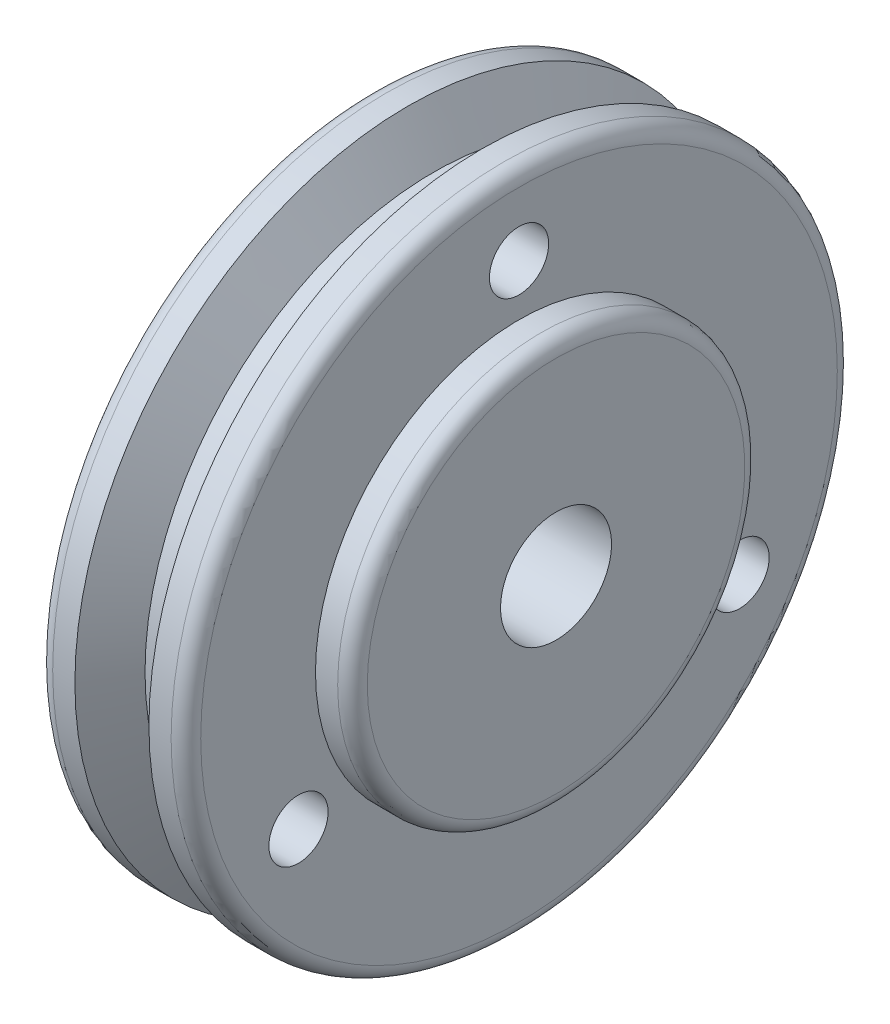
ISO-10303-21;
HEADER;
FILE_DESCRIPTION(('STEP AP214'),'2;1');
FILE_NAME('part.step','',(''),(''),'','','');
FILE_SCHEMA(('AUTOMOTIVE_DESIGN { 1 0 10303 214 1 1 1 1 }'));
ENDSEC;
DATA;
#1=APPLICATION_CONTEXT('core data for automotive mechanical design processes');
#2=APPLICATION_PROTOCOL_DEFINITION('international standard','automotive_design',2000,#1);
#3=PRODUCT_CONTEXT('',#1,'mechanical');
#4=PRODUCT('Part','Part','',(#3));
#5=PRODUCT_RELATED_PRODUCT_CATEGORY('part','',(#4));
#6=PRODUCT_DEFINITION_FORMATION('','',#4);
#7=PRODUCT_DEFINITION_CONTEXT('part definition',#1,'design');
#8=PRODUCT_DEFINITION('design','',#6,#7);
#9=PRODUCT_DEFINITION_SHAPE('','',#8);
#10=(LENGTH_UNIT() NAMED_UNIT(*) SI_UNIT(.MILLI.,.METRE.));
#11=(NAMED_UNIT(*) PLANE_ANGLE_UNIT() SI_UNIT($,.RADIAN.));
#12=(NAMED_UNIT(*) SI_UNIT($,.STERADIAN.) SOLID_ANGLE_UNIT());
#13=UNCERTAINTY_MEASURE_WITH_UNIT(LENGTH_MEASURE(1.E-05),#10,'distance_accuracy_value','');
#14=(GEOMETRIC_REPRESENTATION_CONTEXT(3) GLOBAL_UNCERTAINTY_ASSIGNED_CONTEXT((#13)) GLOBAL_UNIT_ASSIGNED_CONTEXT((#10,
#11,#12)) REPRESENTATION_CONTEXT('',''));
#15=CARTESIAN_POINT('',(0.,0.,0.));
#16=DIRECTION('',(0.,0.,1.));
#17=DIRECTION('',(1.,0.,0.));
#18=AXIS2_PLACEMENT_3D('',#15,#16,#17);
#19=CARTESIAN_POINT('',(18.4991145218418,20.0206611570248,0.));
#20=DIRECTION('',(-1.,0.,0.));
#21=DIRECTION('',(0.,0.,1.));
#22=AXIS2_PLACEMENT_3D('',#19,#20,#21);
#23=PLANE('',#22);
#24=CARTESIAN_POINT('',(18.4991145218418,0.,0.));
#25=DIRECTION('',(-1.,0.,0.));
#26=DIRECTION('',(0.,0.,1.));
#27=AXIS2_PLACEMENT_3D('',#24,#25,#26);
#28=CIRCLE('',#27,25.5);
#29=CARTESIAN_POINT('',(18.4991145218418,0.,25.5));
#30=VERTEX_POINT('',#29);
#31=EDGE_CURVE('E10',#30,#30,#28,.T.);
#32=ORIENTED_EDGE('',*,*,#31,.F.);
#33=EDGE_LOOP('',(#32));
#34=FACE_BOUND('',#33,.T.);
#35=CARTESIAN_POINT('',(18.4991145218418,0.,0.));
#36=DIRECTION('',(-1.,0.,0.));
#37=DIRECTION('',(0.,0.,1.));
#38=AXIS2_PLACEMENT_3D('',#35,#36,#37);
#39=CIRCLE('',#38,7.5);
#40=CARTESIAN_POINT('',(18.4991145218418,0.,7.5));
#41=VERTEX_POINT('',#40);
#42=EDGE_CURVE('E61',#41,#41,#39,.T.);
#43=ORIENTED_EDGE('',*,*,#42,.T.);
#44=EDGE_LOOP('',(#43));
#45=FACE_BOUND('',#44,.T.);
#46=ADVANCED_FACE('F37',(#34,#45),#23,.F.);
#47=CARTESIAN_POINT('',(16.4991145218418,0.,0.));
#48=DIRECTION('',(-1.,0.,0.));
#49=DIRECTION('',(0.,0.,1.));
#50=AXIS2_PLACEMENT_3D('',#47,#48,#49);
#51=TOROIDAL_SURFACE('',#50,25.5,2.);
#52=CARTESIAN_POINT('',(16.4991145218418,0.,0.));
#53=DIRECTION('',(-1.,0.,0.));
#54=DIRECTION('',(0.,0.,1.));
#55=AXIS2_PLACEMENT_3D('',#52,#53,#54);
#56=CIRCLE('',#55,27.5);
#57=CARTESIAN_POINT('',(16.4991145218418,0.,27.5));
#58=VERTEX_POINT('',#57);
#59=EDGE_CURVE('E44',#58,#58,#56,.T.);
#60=ORIENTED_EDGE('',*,*,#59,.F.);
#61=EDGE_LOOP('',(#60));
#62=FACE_BOUND('',#61,.T.);
#63=ORIENTED_EDGE('',*,*,#31,.T.);
#64=EDGE_LOOP('',(#63));
#65=FACE_BOUND('',#64,.T.);
#66=ADVANCED_FACE('F115',(#62,#65),#51,.T.);
#67=CARTESIAN_POINT('',(-33.8562573789847,0.,0.));
#68=DIRECTION('',(-1.,0.,0.));
#69=DIRECTION('',(0.,0.,1.));
#70=AXIS2_PLACEMENT_3D('',#67,#68,#69);
#71=CYLINDRICAL_SURFACE('',#70,27.5);
#72=CARTESIAN_POINT('',(13.4991145218418,0.,0.));
#73=DIRECTION('',(-1.,0.,0.));
#74=DIRECTION('',(0.,0.,1.));
#75=AXIS2_PLACEMENT_3D('',#72,#73,#74);
#76=CIRCLE('',#75,27.5);
#77=CARTESIAN_POINT('',(13.4991145218418,0.,27.5));
#78=VERTEX_POINT('',#77);
#79=EDGE_CURVE('E49',#78,#78,#76,.T.);
#80=ORIENTED_EDGE('',*,*,#79,.F.);
#81=EDGE_LOOP('',(#80));
#82=FACE_BOUND('',#81,.T.);
#83=ORIENTED_EDGE('',*,*,#59,.T.);
#84=EDGE_LOOP('',(#83));
#85=FACE_BOUND('',#84,.T.);
#86=ADVANCED_FACE('F112',(#82,#85),#71,.T.);
#87=CARTESIAN_POINT('',(13.4991145218418,27.5,0.));
#88=DIRECTION('',(-1.,0.,0.));
#89=DIRECTION('',(0.,0.,1.));
#90=AXIS2_PLACEMENT_3D('',#87,#88,#89);
#91=PLANE('',#90);
#92=CARTESIAN_POINT('',(13.4991145218418,34.4021697757463,0.));
#93=DIRECTION('',(1.,0.,0.));
#94=DIRECTION('',(0.,0.,-1.));
#95=AXIS2_PLACEMENT_3D('',#92,#93,#94);
#96=CIRCLE('',#95,4.);
#97=CARTESIAN_POINT('',(13.4991145218418,34.4021697757463,-4.));
#98=VERTEX_POINT('',#97);
#99=EDGE_CURVE('E56',#98,#98,#96,.T.);
#100=ORIENTED_EDGE('',*,*,#99,.F.);
#101=EDGE_LOOP('',(#100));
#102=FACE_BOUND('',#101,.T.);
#103=CARTESIAN_POINT('',(13.4991145218418,-17.2010848878727,-29.7931529711022));
#104=DIRECTION('',(1.,0.,0.));
#105=DIRECTION('',(0.,0.,-1.));
#106=AXIS2_PLACEMENT_3D('',#103,#104,#105);
#107=CIRCLE('',#106,4.00000000000074);
#108=CARTESIAN_POINT('',(13.4991145218418,-17.2010848878727,-33.7931529711029));
#109=VERTEX_POINT('',#108);
#110=EDGE_CURVE('E191',#109,#109,#107,.T.);
#111=ORIENTED_EDGE('',*,*,#110,.F.);
#112=EDGE_LOOP('',(#111));
#113=FACE_BOUND('',#112,.T.);
#114=CARTESIAN_POINT('',(13.4991145218418,-17.2010848878736,29.7931529711008));
#115=DIRECTION('',(1.,0.,0.));
#116=DIRECTION('',(0.,0.,-1.));
#117=AXIS2_PLACEMENT_3D('',#114,#115,#116);
#118=CIRCLE('',#117,4.00000000000111);
#119=CARTESIAN_POINT('',(13.4991145218418,-17.2010848878736,25.7931529710997));
#120=VERTEX_POINT('',#119);
#121=EDGE_CURVE('E73',#120,#120,#118,.T.);
#122=ORIENTED_EDGE('',*,*,#121,.F.);
#123=EDGE_LOOP('',(#122));
#124=FACE_BOUND('',#123,.T.);
#125=CARTESIAN_POINT('',(13.4991145218418,0.,0.));
#126=DIRECTION('',(-1.,0.,0.));
#127=DIRECTION('',(0.,0.,1.));
#128=AXIS2_PLACEMENT_3D('',#125,#126,#127);
#129=CIRCLE('',#128,43.);
#130=CARTESIAN_POINT('',(13.4991145218418,0.,43.));
#131=VERTEX_POINT('',#130);
#132=EDGE_CURVE('E105',#131,#131,#129,.T.);
#133=ORIENTED_EDGE('',*,*,#132,.F.);
#134=EDGE_LOOP('',(#133));
#135=FACE_BOUND('',#134,.T.);
#136=ORIENTED_EDGE('',*,*,#79,.T.);
#137=EDGE_LOOP('',(#136));
#138=FACE_BOUND('',#137,.T.);
#139=ADVANCED_FACE('F110',(#102,#113,#124,#135,#138),#91,.F.);
#140=CARTESIAN_POINT('',(11.4991145218418,0.,0.));
#141=DIRECTION('',(-1.,0.,0.));
#142=DIRECTION('',(0.,0.,1.));
#143=AXIS2_PLACEMENT_3D('',#140,#141,#142);
#144=TOROIDAL_SURFACE('',#143,43.,2.);
#145=CARTESIAN_POINT('',(11.4991145218418,0.,0.));
#146=DIRECTION('',(-1.,0.,0.));
#147=DIRECTION('',(0.,0.,1.));
#148=AXIS2_PLACEMENT_3D('',#145,#146,#147);
#149=CIRCLE('',#148,45.);
#150=CARTESIAN_POINT('',(11.4991145218418,0.,45.));
#151=VERTEX_POINT('',#150);
#152=EDGE_CURVE('E102',#151,#151,#149,.T.);
#153=ORIENTED_EDGE('',*,*,#152,.F.);
#154=EDGE_LOOP('',(#153));
#155=FACE_BOUND('',#154,.T.);
#156=ORIENTED_EDGE('',*,*,#132,.T.);
#157=EDGE_LOOP('',(#156));
#158=FACE_BOUND('',#157,.T.);
#159=ADVANCED_FACE('F127',(#155,#158),#144,.T.);
#160=CARTESIAN_POINT('',(-33.8562573789847,0.,0.));
#161=DIRECTION('',(-1.,0.,0.));
#162=DIRECTION('',(0.,0.,1.));
#163=AXIS2_PLACEMENT_3D('',#160,#161,#162);
#164=CYLINDRICAL_SURFACE('',#163,45.);
#165=CARTESIAN_POINT('',(8.49911452184179,0.,0.));
#166=DIRECTION('',(-1.,0.,0.));
#167=DIRECTION('',(0.,0.,1.));
#168=AXIS2_PLACEMENT_3D('',#165,#166,#167);
#169=CIRCLE('',#168,45.);
#170=CARTESIAN_POINT('',(8.49911452184179,0.,45.));
#171=VERTEX_POINT('',#170);
#172=EDGE_CURVE('E99',#171,#171,#169,.T.);
#173=ORIENTED_EDGE('',*,*,#172,.F.);
#174=EDGE_LOOP('',(#173));
#175=FACE_BOUND('',#174,.T.);
#176=ORIENTED_EDGE('',*,*,#152,.T.);
#177=EDGE_LOOP('',(#176));
#178=FACE_BOUND('',#177,.T.);
#179=ADVANCED_FACE('F131',(#175,#178),#164,.T.);
#180=CARTESIAN_POINT('',(8.49911452184179,0.,0.));
#181=DIRECTION('',(1.,0.,0.));
#182=DIRECTION('',(0.,0.,-1.));
#183=AXIS2_PLACEMENT_3D('',#180,#181,#182);
#184=CONICAL_SURFACE('',#183,45.,1.17190446851137);
#185=CARTESIAN_POINT('',(5.97018890200708,0.,0.));
#186=DIRECTION('',(-1.,0.,0.));
#187=DIRECTION('',(0.,0.,1.));
#188=AXIS2_PLACEMENT_3D('',#185,#186,#187);
#189=CIRCLE('',#188,39.);
#190=CARTESIAN_POINT('',(5.97018890200708,0.,39.));
#191=VERTEX_POINT('',#190);
#192=EDGE_CURVE('E96',#191,#191,#189,.T.);
#193=ORIENTED_EDGE('',*,*,#192,.F.);
#194=EDGE_LOOP('',(#193));
#195=FACE_BOUND('',#194,.T.);
#196=ORIENTED_EDGE('',*,*,#172,.T.);
#197=EDGE_LOOP('',(#196));
#198=FACE_BOUND('',#197,.T.);
#199=ADVANCED_FACE('F135',(#195,#198),#184,.T.);
#200=CARTESIAN_POINT('',(-33.8562573789847,0.,0.));
#201=DIRECTION('',(-1.,0.,0.));
#202=DIRECTION('',(0.,0.,1.));
#203=AXIS2_PLACEMENT_3D('',#200,#201,#202);
#204=CYLINDRICAL_SURFACE('',#203,39.);
#205=CARTESIAN_POINT('',(1.97018890200708,0.,0.));
#206=DIRECTION('',(-1.,0.,0.));
#207=DIRECTION('',(0.,0.,1.));
#208=AXIS2_PLACEMENT_3D('',#205,#206,#207);
#209=CIRCLE('',#208,39.);
#210=CARTESIAN_POINT('',(1.97018890200708,0.,39.));
#211=VERTEX_POINT('',#210);
#212=EDGE_CURVE('E93',#211,#211,#209,.T.);
#213=ORIENTED_EDGE('',*,*,#212,.F.);
#214=EDGE_LOOP('',(#213));
#215=FACE_BOUND('',#214,.T.);
#216=ORIENTED_EDGE('',*,*,#192,.T.);
#217=EDGE_LOOP('',(#216));
#218=FACE_BOUND('',#217,.T.);
#219=ADVANCED_FACE('F139',(#215,#218),#204,.T.);
#220=CARTESIAN_POINT('',(1.97018890200708,0.,0.));
#221=DIRECTION('',(-1.,0.,0.));
#222=DIRECTION('',(0.,0.,1.));
#223=AXIS2_PLACEMENT_3D('',#220,#221,#222);
#224=CONICAL_SURFACE('',#223,39.,1.04632639416877);
#225=CARTESIAN_POINT('',(-1.50088547815821,0.,0.));
#226=DIRECTION('',(-1.,0.,0.));
#227=DIRECTION('',(0.,0.,1.));
#228=AXIS2_PLACEMENT_3D('',#225,#226,#227);
#229=CIRCLE('',#228,45.);
#230=CARTESIAN_POINT('',(-1.50088547815821,0.,45.));
#231=VERTEX_POINT('',#230);
#232=EDGE_CURVE('E90',#231,#231,#229,.T.);
#233=ORIENTED_EDGE('',*,*,#232,.F.);
#234=EDGE_LOOP('',(#233));
#235=FACE_BOUND('',#234,.T.);
#236=ORIENTED_EDGE('',*,*,#212,.T.);
#237=EDGE_LOOP('',(#236));
#238=FACE_BOUND('',#237,.T.);
#239=ADVANCED_FACE('F143',(#235,#238),#224,.T.);
#240=CARTESIAN_POINT('',(-33.8562573789847,0.,0.));
#241=DIRECTION('',(-1.,0.,0.));
#242=DIRECTION('',(0.,0.,1.));
#243=AXIS2_PLACEMENT_3D('',#240,#241,#242);
#244=CYLINDRICAL_SURFACE('',#243,45.);
#245=CARTESIAN_POINT('',(-4.5008854781582,0.,0.));
#246=DIRECTION('',(-1.,0.,0.));
#247=DIRECTION('',(0.,0.,1.));
#248=AXIS2_PLACEMENT_3D('',#245,#246,#247);
#249=CIRCLE('',#248,45.);
#250=CARTESIAN_POINT('',(-4.5008854781582,0.,45.));
#251=VERTEX_POINT('',#250);
#252=EDGE_CURVE('E87',#251,#251,#249,.T.);
#253=ORIENTED_EDGE('',*,*,#252,.F.);
#254=EDGE_LOOP('',(#253));
#255=FACE_BOUND('',#254,.T.);
#256=ORIENTED_EDGE('',*,*,#232,.T.);
#257=EDGE_LOOP('',(#256));
#258=FACE_BOUND('',#257,.T.);
#259=ADVANCED_FACE('F147',(#255,#258),#244,.T.);
#260=CARTESIAN_POINT('',(-4.50088547815821,0.,0.));
#261=DIRECTION('',(-1.,0.,0.));
#262=DIRECTION('',(0.,0.,1.));
#263=AXIS2_PLACEMENT_3D('',#260,#261,#262);
#264=TOROIDAL_SURFACE('',#263,43.,2.);
#265=CARTESIAN_POINT('',(-6.50088547815821,0.,0.));
#266=DIRECTION('',(-1.,0.,0.));
#267=DIRECTION('',(0.,0.,1.));
#268=AXIS2_PLACEMENT_3D('',#265,#266,#267);
#269=CIRCLE('',#268,43.);
#270=CARTESIAN_POINT('',(-6.50088547815821,0.,43.));
#271=VERTEX_POINT('',#270);
#272=EDGE_CURVE('E84',#271,#271,#269,.T.);
#273=ORIENTED_EDGE('',*,*,#272,.F.);
#274=EDGE_LOOP('',(#273));
#275=FACE_BOUND('',#274,.T.);
#276=ORIENTED_EDGE('',*,*,#252,.T.);
#277=EDGE_LOOP('',(#276));
#278=FACE_BOUND('',#277,.T.);
#279=ADVANCED_FACE('F151',(#275,#278),#264,.T.);
#280=CARTESIAN_POINT('',(-6.50088547815821,17.5,0.));
#281=DIRECTION('',(1.,0.,0.));
#282=DIRECTION('',(0.,0.,-1.));
#283=AXIS2_PLACEMENT_3D('',#280,#281,#282);
#284=PLANE('',#283);
#285=CARTESIAN_POINT('',(-6.50088547815821,34.4021697757463,0.));
#286=DIRECTION('',(1.,0.,0.));
#287=DIRECTION('',(0.,0.,-1.));
#288=AXIS2_PLACEMENT_3D('',#285,#286,#287);
#289=CIRCLE('',#288,4.);
#290=CARTESIAN_POINT('',(-6.50088547815821,34.4021697757463,-4.));
#291=VERTEX_POINT('',#290);
#292=EDGE_CURVE('E40',#291,#291,#289,.T.);
#293=ORIENTED_EDGE('',*,*,#292,.T.);
#294=EDGE_LOOP('',(#293));
#295=FACE_BOUND('',#294,.T.);
#296=CARTESIAN_POINT('',(-6.50088547815821,-17.2010848878727,-29.7931529711022));
#297=DIRECTION('',(1.,0.,0.));
#298=DIRECTION('',(0.,0.,-1.));
#299=AXIS2_PLACEMENT_3D('',#296,#297,#298);
#300=CIRCLE('',#299,4.00000000000074);
#301=CARTESIAN_POINT('',(-6.50088547815821,-17.2010848878727,-33.7931529711029));
#302=VERTEX_POINT('',#301);
#303=EDGE_CURVE('E55',#302,#302,#300,.T.);
#304=ORIENTED_EDGE('',*,*,#303,.T.);
#305=EDGE_LOOP('',(#304));
#306=FACE_BOUND('',#305,.T.);
#307=CARTESIAN_POINT('',(-6.50088547815821,-17.2010848878736,29.7931529711008));
#308=DIRECTION('',(1.,0.,0.));
#309=DIRECTION('',(0.,0.,-1.));
#310=AXIS2_PLACEMENT_3D('',#307,#308,#309);
#311=CIRCLE('',#310,4.00000000000111);
#312=CARTESIAN_POINT('',(-6.50088547815821,-17.2010848878736,25.7931529710997));
#313=VERTEX_POINT('',#312);
#314=EDGE_CURVE('E53',#313,#313,#311,.T.);
#315=ORIENTED_EDGE('',*,*,#314,.T.);
#316=EDGE_LOOP('',(#315));
#317=FACE_BOUND('',#316,.T.);
#318=CARTESIAN_POINT('',(-6.50088547815821,0.,0.));
#319=DIRECTION('',(-1.,0.,0.));
#320=DIRECTION('',(0.,0.,1.));
#321=AXIS2_PLACEMENT_3D('',#318,#319,#320);
#322=CIRCLE('',#321,17.5);
#323=CARTESIAN_POINT('',(-6.50088547815821,0.,17.5));
#324=VERTEX_POINT('',#323);
#325=EDGE_CURVE('E81',#324,#324,#322,.T.);
#326=ORIENTED_EDGE('',*,*,#325,.F.);
#327=EDGE_LOOP('',(#326));
#328=FACE_BOUND('',#327,.T.);
#329=ORIENTED_EDGE('',*,*,#272,.T.);
#330=EDGE_LOOP('',(#329));
#331=FACE_BOUND('',#330,.T.);
#332=ADVANCED_FACE('F155',(#295,#306,#317,#328,#331),#284,.F.);
#333=CARTESIAN_POINT('',(-33.8562573789847,0.,0.));
#334=DIRECTION('',(-1.,0.,0.));
#335=DIRECTION('',(0.,0.,1.));
#336=AXIS2_PLACEMENT_3D('',#333,#334,#335);
#337=CYLINDRICAL_SURFACE('',#336,17.5);
#338=CARTESIAN_POINT('',(-20.5008854781582,0.,0.));
#339=DIRECTION('',(-1.,0.,0.));
#340=DIRECTION('',(0.,0.,1.));
#341=AXIS2_PLACEMENT_3D('',#338,#339,#340);
#342=CIRCLE('',#341,17.5);
#343=CARTESIAN_POINT('',(-20.5008854781582,0.,17.5));
#344=VERTEX_POINT('',#343);
#345=EDGE_CURVE('E78',#344,#344,#342,.T.);
#346=ORIENTED_EDGE('',*,*,#345,.F.);
#347=EDGE_LOOP('',(#346));
#348=FACE_BOUND('',#347,.T.);
#349=ORIENTED_EDGE('',*,*,#325,.T.);
#350=EDGE_LOOP('',(#349));
#351=FACE_BOUND('',#350,.T.);
#352=ADVANCED_FACE('F159',(#348,#351),#337,.T.);
#353=CARTESIAN_POINT('',(-20.5008854781582,0.,0.));
#354=DIRECTION('',(-1.,0.,0.));
#355=DIRECTION('',(0.,0.,1.));
#356=AXIS2_PLACEMENT_3D('',#353,#354,#355);
#357=TOROIDAL_SURFACE('',#356,15.5,2.);
#358=CARTESIAN_POINT('',(-22.5008854781582,0.,0.));
#359=DIRECTION('',(-1.,0.,0.));
#360=DIRECTION('',(0.,0.,1.));
#361=AXIS2_PLACEMENT_3D('',#358,#359,#360);
#362=CIRCLE('',#361,15.5);
#363=CARTESIAN_POINT('',(-22.5008854781582,0.,15.5));
#364=VERTEX_POINT('',#363);
#365=EDGE_CURVE('E70',#364,#364,#362,.T.);
#366=ORIENTED_EDGE('',*,*,#365,.F.);
#367=EDGE_LOOP('',(#366));
#368=FACE_BOUND('',#367,.T.);
#369=ORIENTED_EDGE('',*,*,#345,.T.);
#370=EDGE_LOOP('',(#369));
#371=FACE_BOUND('',#370,.T.);
#372=ADVANCED_FACE('F162',(#368,#371),#357,.T.);
#373=CARTESIAN_POINT('',(-22.5008854781582,15.5,0.));
#374=DIRECTION('',(1.,0.,0.));
#375=DIRECTION('',(0.,0.,-1.));
#376=AXIS2_PLACEMENT_3D('',#373,#374,#375);
#377=PLANE('',#376);
#378=CARTESIAN_POINT('',(-22.5008854781582,0.,0.));
#379=DIRECTION('',(-1.,0.,0.));
#380=DIRECTION('',(0.,0.,1.));
#381=AXIS2_PLACEMENT_3D('',#378,#379,#380);
#382=CIRCLE('',#381,7.5);
#383=CARTESIAN_POINT('',(-22.5008854781582,0.,7.5));
#384=VERTEX_POINT('',#383);
#385=EDGE_CURVE('E65',#384,#384,#382,.T.);
#386=ORIENTED_EDGE('',*,*,#385,.F.);
#387=EDGE_LOOP('',(#386));
#388=FACE_BOUND('',#387,.T.);
#389=ORIENTED_EDGE('',*,*,#365,.T.);
#390=EDGE_LOOP('',(#389));
#391=FACE_BOUND('',#390,.T.);
#392=ADVANCED_FACE('F166',(#388,#391),#377,.F.);
#393=CARTESIAN_POINT('',(-33.8562573789847,0.,0.));
#394=DIRECTION('',(-1.,0.,0.));
#395=DIRECTION('',(0.,0.,1.));
#396=AXIS2_PLACEMENT_3D('',#393,#394,#395);
#397=CYLINDRICAL_SURFACE('',#396,7.5);
#398=ORIENTED_EDGE('',*,*,#42,.F.);
#399=EDGE_LOOP('',(#398));
#400=FACE_BOUND('',#399,.T.);
#401=ORIENTED_EDGE('',*,*,#385,.T.);
#402=EDGE_LOOP('',(#401));
#403=FACE_BOUND('',#402,.T.);
#404=ADVANCED_FACE('F170',(#400,#403),#397,.F.);
#405=CARTESIAN_POINT('',(-22.5008854781582,-17.2010848878736,29.7931529711008));
#406=DIRECTION('',(1.,0.,0.));
#407=DIRECTION('',(0.,0.,-1.));
#408=AXIS2_PLACEMENT_3D('',#405,#406,#407);
#409=CYLINDRICAL_SURFACE('',#408,4.00000000000111);
#410=ORIENTED_EDGE('',*,*,#121,.T.);
#411=EDGE_LOOP('',(#410));
#412=FACE_BOUND('',#411,.T.);
#413=ORIENTED_EDGE('',*,*,#314,.F.);
#414=EDGE_LOOP('',(#413));
#415=FACE_BOUND('',#414,.T.);
#416=ADVANCED_FACE('F174',(#412,#415),#409,.F.);
#417=CARTESIAN_POINT('',(-22.5008854781582,-17.2010848878727,-29.7931529711022));
#418=DIRECTION('',(1.,0.,0.));
#419=DIRECTION('',(0.,0.,-1.));
#420=AXIS2_PLACEMENT_3D('',#417,#418,#419);
#421=CYLINDRICAL_SURFACE('',#420,4.00000000000074);
#422=ORIENTED_EDGE('',*,*,#110,.T.);
#423=EDGE_LOOP('',(#422));
#424=FACE_BOUND('',#423,.T.);
#425=ORIENTED_EDGE('',*,*,#303,.F.);
#426=EDGE_LOOP('',(#425));
#427=FACE_BOUND('',#426,.T.);
#428=ADVANCED_FACE('F178',(#424,#427),#421,.F.);
#429=CARTESIAN_POINT('',(-22.5008854781582,34.4021697757463,0.));
#430=DIRECTION('',(1.,0.,0.));
#431=DIRECTION('',(0.,0.,-1.));
#432=AXIS2_PLACEMENT_3D('',#429,#430,#431);
#433=CYLINDRICAL_SURFACE('',#432,4.);
#434=ORIENTED_EDGE('',*,*,#99,.T.);
#435=EDGE_LOOP('',(#434));
#436=FACE_BOUND('',#435,.T.);
#437=ORIENTED_EDGE('',*,*,#292,.F.);
#438=EDGE_LOOP('',(#437));
#439=FACE_BOUND('',#438,.T.);
#440=ADVANCED_FACE('F182',(#436,#439),#433,.F.);
#441=CLOSED_SHELL('',(#46,#66,#86,#139,#159,#179,#199,#219,#239,#259,#279,#332,#352,#372,#392,
#404,#416,#428,#440));
#442=MANIFOLD_SOLID_BREP('B2',#441);
#443=ADVANCED_BREP_SHAPE_REPRESENTATION('',(#18,#442),#14);
#444=SHAPE_DEFINITION_REPRESENTATION(#9,#443);
ENDSEC;
END-ISO-10303-21;
